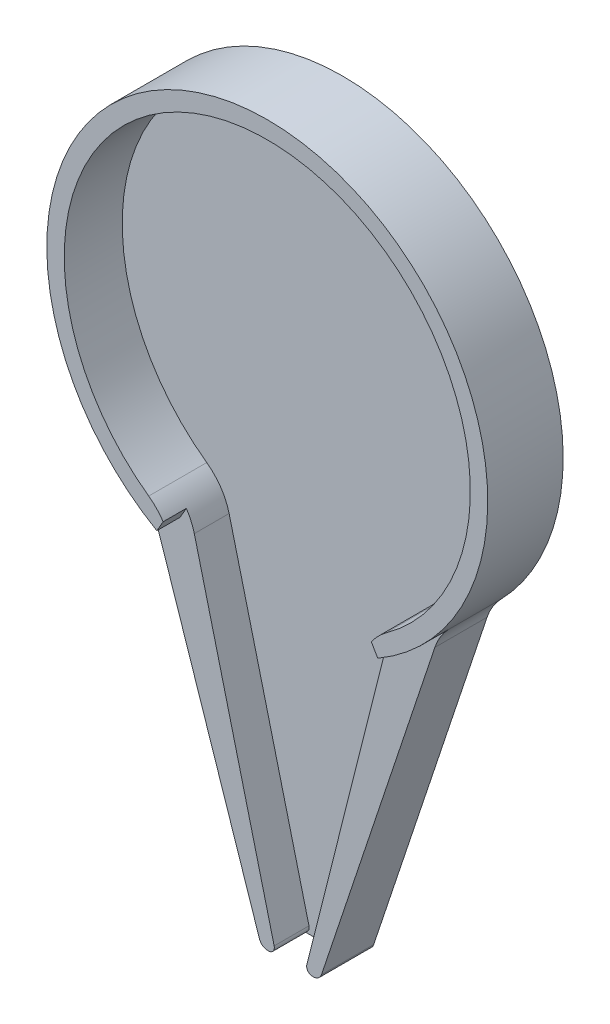
ISO-10303-21;
HEADER;
FILE_DESCRIPTION(('STEP AP214'),'2;1');
FILE_NAME('part.step','',(''),(''),'','','');
FILE_SCHEMA(('AUTOMOTIVE_DESIGN { 1 0 10303 214 1 1 1 1 }'));
ENDSEC;
DATA;
#1=APPLICATION_CONTEXT('core data for automotive mechanical design processes');
#2=APPLICATION_PROTOCOL_DEFINITION('international standard','automotive_design',2000,#1);
#3=PRODUCT_CONTEXT('',#1,'mechanical');
#4=PRODUCT('Part','Part','',(#3));
#5=PRODUCT_RELATED_PRODUCT_CATEGORY('part','',(#4));
#6=PRODUCT_DEFINITION_FORMATION('','',#4);
#7=PRODUCT_DEFINITION_CONTEXT('part definition',#1,'design');
#8=PRODUCT_DEFINITION('design','',#6,#7);
#9=PRODUCT_DEFINITION_SHAPE('','',#8);
#10=(LENGTH_UNIT() NAMED_UNIT(*) SI_UNIT(.MILLI.,.METRE.));
#11=(NAMED_UNIT(*) PLANE_ANGLE_UNIT() SI_UNIT($,.RADIAN.));
#12=(NAMED_UNIT(*) SI_UNIT($,.STERADIAN.) SOLID_ANGLE_UNIT());
#13=UNCERTAINTY_MEASURE_WITH_UNIT(LENGTH_MEASURE(1.E-05),#10,'distance_accuracy_value','');
#14=(GEOMETRIC_REPRESENTATION_CONTEXT(3) GLOBAL_UNCERTAINTY_ASSIGNED_CONTEXT((#13)) GLOBAL_UNIT_ASSIGNED_CONTEXT((#10,
#11,#12)) REPRESENTATION_CONTEXT('',''));
#15=CARTESIAN_POINT('',(0.,0.,0.));
#16=DIRECTION('',(0.,0.,1.));
#17=DIRECTION('',(1.,0.,0.));
#18=AXIS2_PLACEMENT_3D('',#15,#16,#17);
#19=CARTESIAN_POINT('',(0.,0.,10.));
#20=DIRECTION('',(0.,0.,-1.));
#21=DIRECTION('',(-1.,0.,0.));
#22=AXIS2_PLACEMENT_3D('',#19,#20,#21);
#23=CYLINDRICAL_SURFACE('',#22,38.);
#24=CARTESIAN_POINT('',(0.,0.,6.));
#25=DIRECTION('',(0.,0.,1.));
#26=DIRECTION('',(1.,0.,0.));
#27=AXIS2_PLACEMENT_3D('',#24,#25,#26);
#28=CIRCLE('',#27,38.);
#29=CARTESIAN_POINT('',(19.0375883050422,-32.8872350848733,6.));
#30=VERTEX_POINT('',#29);
#31=CARTESIAN_POINT('',(27.2119952938566,-26.5237122614299,6.));
#32=VERTEX_POINT('',#31);
#33=EDGE_CURVE('E321',#30,#32,#28,.T.);
#34=ORIENTED_EDGE('',*,*,#33,.T.);
#35=DIRECTION('',(0.,0.,-1.));
#36=VECTOR('',#35,1.);
#37=CARTESIAN_POINT('',(27.2119952938566,-26.5237122614299,10.));
#38=LINE('',#37,#36);
#39=CARTESIAN_POINT('',(27.2119952938566,-26.5237122614299,-3.));
#40=VERTEX_POINT('',#39);
#41=EDGE_CURVE('E258',#32,#40,#38,.T.);
#42=ORIENTED_EDGE('',*,*,#41,.T.);
#43=CARTESIAN_POINT('',(0.,0.,-3.));
#44=DIRECTION('',(0.,0.,-1.));
#45=DIRECTION('',(-1.,0.,0.));
#46=AXIS2_PLACEMENT_3D('',#43,#44,#45);
#47=CIRCLE('',#46,38.);
#48=CARTESIAN_POINT('',(-27.2119952938566,-26.5237122614299,-3.));
#49=VERTEX_POINT('',#48);
#50=EDGE_CURVE('E219',#49,#40,#47,.T.);
#51=ORIENTED_EDGE('',*,*,#50,.F.);
#52=DIRECTION('',(0.,0.,-1.));
#53=VECTOR('',#52,1.);
#54=CARTESIAN_POINT('',(-27.2119952938566,-26.5237122614299,10.));
#55=LINE('',#54,#53);
#56=CARTESIAN_POINT('',(-27.2119952938566,-26.5237122614299,6.));
#57=VERTEX_POINT('',#56);
#58=EDGE_CURVE('E197',#49,#57,#55,.F.);
#59=ORIENTED_EDGE('',*,*,#58,.T.);
#60=CARTESIAN_POINT('',(0.,0.,6.));
#61=DIRECTION('',(0.,0.,1.));
#62=DIRECTION('',(1.,0.,0.));
#63=AXIS2_PLACEMENT_3D('',#60,#61,#62);
#64=CIRCLE('',#63,38.);
#65=CARTESIAN_POINT('',(-19.0375883050422,-32.8872350848733,6.));
#66=VERTEX_POINT('',#65);
#67=EDGE_CURVE('E175',#57,#66,#64,.T.);
#68=ORIENTED_EDGE('',*,*,#67,.T.);
#69=DIRECTION('',(0.,0.,-1.));
#70=VECTOR('',#69,1.);
#71=CARTESIAN_POINT('',(-19.0375883050422,-32.8872350848733,10.));
#72=LINE('',#71,#70);
#73=CARTESIAN_POINT('',(-19.0375883050422,-32.8872350848733,10.));
#74=VERTEX_POINT('',#73);
#75=EDGE_CURVE('E185',#74,#66,#72,.T.);
#76=ORIENTED_EDGE('',*,*,#75,.F.);
#77=CARTESIAN_POINT('',(0.,0.,10.));
#78=DIRECTION('',(0.,0.,1.));
#79=DIRECTION('',(1.,0.,0.));
#80=AXIS2_PLACEMENT_3D('',#77,#78,#79);
#81=CIRCLE('',#80,38.);
#82=CARTESIAN_POINT('',(19.0375883050422,-32.8872350848733,10.));
#83=VERTEX_POINT('',#82);
#84=EDGE_CURVE('E182',#83,#74,#81,.T.);
#85=ORIENTED_EDGE('',*,*,#84,.F.);
#86=DIRECTION('',(0.,0.,-1.));
#87=VECTOR('',#86,1.);
#88=CARTESIAN_POINT('',(19.0375883050422,-32.8872350848733,10.));
#89=LINE('',#88,#87);
#90=EDGE_CURVE('E192',#83,#30,#89,.T.);
#91=ORIENTED_EDGE('',*,*,#90,.T.);
#92=EDGE_LOOP('',(#34,#42,#51,#59,#68,#76,#85,#91));
#93=FACE_BOUND('',#92,.T.);
#94=ADVANCED_FACE('F33',(#93),#23,.T.);
#95=CARTESIAN_POINT('',(0.,0.,0.));
#96=DIRECTION('',(0.,0.,-1.));
#97=DIRECTION('',(-1.,0.,0.));
#98=AXIS2_PLACEMENT_3D('',#95,#96,#97);
#99=PLANE('',#98);
#100=DIRECTION('',(-0.24417602211815,-0.969730926712434,0.));
#101=VECTOR('',#100,1.);
#102=CARTESIAN_POINT('',(17.5346208072758,-30.290874420278,0.));
#103=LINE('',#102,#101);
#104=CARTESIAN_POINT('',(16.5778493296892,-34.090636917691,0.));
#105=VERTEX_POINT('',#104);
#106=CARTESIAN_POINT('',(2.81328066737598,-88.7558239778818,0.));
#107=VERTEX_POINT('',#106);
#108=EDGE_CURVE('E347',#105,#107,#103,.T.);
#109=ORIENTED_EDGE('',*,*,#108,.F.);
#110=CARTESIAN_POINT('',(26.2751585968136,-36.5323971388724,0.));
#111=DIRECTION('',(0.,0.,-1.));
#112=DIRECTION('',(-1.,0.,0.));
#113=AXIS2_PLACEMENT_3D('',#110,#111,#112);
#114=CIRCLE('',#113,10.);
#115=CARTESIAN_POINT('',(20.4362344641883,-28.4140866635675,0.));
#116=VERTEX_POINT('',#115);
#117=EDGE_CURVE('E262',#105,#116,#114,.T.);
#118=ORIENTED_EDGE('',*,*,#117,.T.);
#119=CARTESIAN_POINT('',(0.,0.,0.));
#120=DIRECTION('',(0.,0.,1.));
#121=DIRECTION('',(1.,0.,0.));
#122=AXIS2_PLACEMENT_3D('',#119,#120,#121);
#123=CIRCLE('',#122,35.);
#124=CARTESIAN_POINT('',(-20.4362344641883,-28.4140866635675,0.));
#125=VERTEX_POINT('',#124);
#126=EDGE_CURVE('E223',#116,#125,#123,.T.);
#127=ORIENTED_EDGE('',*,*,#126,.T.);
#128=CARTESIAN_POINT('',(-26.2751585968136,-36.5323971388724,0.));
#129=DIRECTION('',(0.,0.,-1.));
#130=DIRECTION('',(-1.,0.,0.));
#131=AXIS2_PLACEMENT_3D('',#128,#129,#130);
#132=CIRCLE('',#131,10.);
#133=CARTESIAN_POINT('',(-16.5778493296892,-34.090636917691,0.));
#134=VERTEX_POINT('',#133);
#135=EDGE_CURVE('E264',#125,#134,#132,.T.);
#136=ORIENTED_EDGE('',*,*,#135,.T.);
#137=DIRECTION('',(-0.24417602211815,0.969730926712434,0.));
#138=VECTOR('',#137,1.);
#139=CARTESIAN_POINT('',(-17.5346208072758,-30.290874420278,0.));
#140=LINE('',#139,#138);
#141=CARTESIAN_POINT('',(-2.81328066737598,-88.7558239778818,0.));
#142=VERTEX_POINT('',#141);
#143=EDGE_CURVE('E206',#142,#134,#140,.T.);
#144=ORIENTED_EDGE('',*,*,#143,.F.);
#145=CARTESIAN_POINT('',(-3.78301159408841,-89.,0.));
#146=DIRECTION('',(0.,0.,-1.));
#147=DIRECTION('',(-1.,0.,0.));
#148=AXIS2_PLACEMENT_3D('',#145,#146,#147);
#149=CIRCLE('',#148,1.);
#150=CARTESIAN_POINT('',(-3.78301159408841,-90.,0.));
#151=VERTEX_POINT('',#150);
#152=EDGE_CURVE('E294',#142,#151,#149,.T.);
#153=ORIENTED_EDGE('',*,*,#152,.T.);
#154=DIRECTION('',(1.,0.,0.));
#155=VECTOR('',#154,1.);
#156=CARTESIAN_POINT('',(-5.,-90.,0.));
#157=LINE('',#156,#155);
#158=CARTESIAN_POINT('',(3.78301159408841,-90.,0.));
#159=VERTEX_POINT('',#158);
#160=EDGE_CURVE('E211',#151,#159,#157,.T.);
#161=ORIENTED_EDGE('',*,*,#160,.T.);
#162=CARTESIAN_POINT('',(3.78301159408841,-89.,0.));
#163=DIRECTION('',(0.,0.,-1.));
#164=DIRECTION('',(-1.,0.,0.));
#165=AXIS2_PLACEMENT_3D('',#162,#163,#164);
#166=CIRCLE('',#165,1.);
#167=EDGE_CURVE('E292',#159,#107,#166,.T.);
#168=ORIENTED_EDGE('',*,*,#167,.T.);
#169=EDGE_LOOP('',(#109,#118,#127,#136,#144,#153,#161,#168));
#170=FACE_BOUND('',#169,.T.);
#171=ADVANCED_FACE('F384',(#170),#99,.F.);
#172=CARTESIAN_POINT('',(0.,0.,10.));
#173=DIRECTION('',(0.,0.,1.));
#174=DIRECTION('',(1.,0.,0.));
#175=AXIS2_PLACEMENT_3D('',#172,#173,#174);
#176=PLANE('',#175);
#177=CARTESIAN_POINT('',(0.,0.,10.));
#178=DIRECTION('',(0.,0.,1.));
#179=DIRECTION('',(1.,0.,0.));
#180=AXIS2_PLACEMENT_3D('',#177,#178,#179);
#181=CIRCLE('',#180,35.);
#182=CARTESIAN_POINT('',(20.4362344641883,-28.4140866635675,10.));
#183=VERTEX_POINT('',#182);
#184=CARTESIAN_POINT('',(-20.4362344641883,-28.4140866635675,10.));
#185=VERTEX_POINT('',#184);
#186=EDGE_CURVE('E224',#183,#185,#181,.T.);
#187=ORIENTED_EDGE('',*,*,#186,.F.);
#188=CARTESIAN_POINT('',(26.2751585968136,-36.5323971388724,10.));
#189=DIRECTION('',(0.,0.,1.));
#190=DIRECTION('',(1.,0.,0.));
#191=AXIS2_PLACEMENT_3D('',#188,#189,#190);
#192=CIRCLE('',#191,10.);
#193=CARTESIAN_POINT('',(17.9450327383881,-30.9998567474436,10.));
#194=VERTEX_POINT('',#193);
#195=EDGE_CURVE('E242',#183,#194,#192,.T.);
#196=ORIENTED_EDGE('',*,*,#195,.T.);
#197=DIRECTION('',(-0.500989165922165,0.865453554865085,0.));
#198=VECTOR('',#197,1.);
#199=CARTESIAN_POINT('',(19.0375883050422,-32.8872350848733,10.));
#200=LINE('',#199,#198);
#201=EDGE_CURVE('E198',#83,#194,#200,.T.);
#202=ORIENTED_EDGE('',*,*,#201,.F.);
#203=ORIENTED_EDGE('',*,*,#84,.T.);
#204=DIRECTION('',(-0.500989165922165,-0.865453554865085,0.));
#205=VECTOR('',#204,1.);
#206=CARTESIAN_POINT('',(-19.0375883050422,-32.8872350848733,10.));
#207=LINE('',#206,#205);
#208=CARTESIAN_POINT('',(-17.9450327383881,-30.9998567474436,10.));
#209=VERTEX_POINT('',#208);
#210=EDGE_CURVE('E188',#209,#74,#207,.T.);
#211=ORIENTED_EDGE('',*,*,#210,.F.);
#212=CARTESIAN_POINT('',(-26.2751585968136,-36.5323971388724,10.));
#213=DIRECTION('',(0.,0.,1.));
#214=DIRECTION('',(1.,0.,0.));
#215=AXIS2_PLACEMENT_3D('',#212,#213,#214);
#216=CIRCLE('',#215,10.);
#217=EDGE_CURVE('E240',#209,#185,#216,.T.);
#218=ORIENTED_EDGE('',*,*,#217,.T.);
#219=EDGE_LOOP('',(#187,#196,#202,#203,#211,#218));
#220=FACE_BOUND('',#219,.T.);
#221=ADVANCED_FACE('F368',(#220),#176,.T.);
#222=CARTESIAN_POINT('',(0.,0.,10.));
#223=DIRECTION('',(0.,0.,-1.));
#224=DIRECTION('',(-1.,0.,0.));
#225=AXIS2_PLACEMENT_3D('',#222,#223,#224);
#226=CYLINDRICAL_SURFACE('',#225,35.);
#227=ORIENTED_EDGE('',*,*,#126,.F.);
#228=DIRECTION('',(0.,0.,-1.));
#229=VECTOR('',#228,1.);
#230=CARTESIAN_POINT('',(20.4362344641883,-28.4140866635675,10.));
#231=LINE('',#230,#229);
#232=EDGE_CURVE('E238',#116,#183,#231,.F.);
#233=ORIENTED_EDGE('',*,*,#232,.T.);
#234=ORIENTED_EDGE('',*,*,#186,.T.);
#235=DIRECTION('',(0.,0.,-1.));
#236=VECTOR('',#235,1.);
#237=CARTESIAN_POINT('',(-20.4362344641883,-28.4140866635675,10.));
#238=LINE('',#237,#236);
#239=EDGE_CURVE('E235',#185,#125,#238,.T.);
#240=ORIENTED_EDGE('',*,*,#239,.T.);
#241=EDGE_LOOP('',(#227,#233,#234,#240));
#242=FACE_BOUND('',#241,.T.);
#243=ADVANCED_FACE('F422',(#242),#226,.F.);
#244=CARTESIAN_POINT('',(0.,0.,-3.));
#245=DIRECTION('',(0.,0.,-1.));
#246=DIRECTION('',(-1.,0.,0.));
#247=AXIS2_PLACEMENT_3D('',#244,#245,#246);
#248=PLANE('',#247);
#249=DIRECTION('',(0.316227766016838,0.948683298050514,0.));
#250=VECTOR('',#249,1.);
#251=CARTESIAN_POINT('',(5.,-90.,-3.));
#252=LINE('',#251,#250);
#253=CARTESIAN_POINT('',(5.34188611699158,-88.9743416490252,-3.));
#254=VERTEX_POINT('',#253);
#255=CARTESIAN_POINT('',(24.8862137064716,-30.3413588805852,-3.));
#256=VERTEX_POINT('',#255);
#257=EDGE_CURVE('E217',#254,#256,#252,.T.);
#258=ORIENTED_EDGE('',*,*,#257,.F.);
#259=CARTESIAN_POINT('',(3.91886116991581,-88.5,-3.));
#260=DIRECTION('',(0.,0.,-1.));
#261=DIRECTION('',(-1.,0.,0.));
#262=AXIS2_PLACEMENT_3D('',#259,#260,#261);
#263=CIRCLE('',#262,1.5);
#264=CARTESIAN_POINT('',(3.91886116991581,-90.,-3.));
#265=VERTEX_POINT('',#264);
#266=EDGE_CURVE('E307',#254,#265,#263,.T.);
#267=ORIENTED_EDGE('',*,*,#266,.T.);
#268=DIRECTION('',(1.,0.,0.));
#269=VECTOR('',#268,1.);
#270=CARTESIAN_POINT('',(-5.,-90.,-3.));
#271=LINE('',#270,#269);
#272=CARTESIAN_POINT('',(-3.91886116991581,-90.,-3.));
#273=VERTEX_POINT('',#272);
#274=EDGE_CURVE('E214',#273,#265,#271,.T.);
#275=ORIENTED_EDGE('',*,*,#274,.F.);
#276=CARTESIAN_POINT('',(-3.91886116991581,-88.5,-3.));
#277=DIRECTION('',(0.,0.,-1.));
#278=DIRECTION('',(-1.,0.,0.));
#279=AXIS2_PLACEMENT_3D('',#276,#277,#278);
#280=CIRCLE('',#279,1.5);
#281=CARTESIAN_POINT('',(-5.34188611699158,-88.9743416490252,-3.));
#282=VERTEX_POINT('',#281);
#283=EDGE_CURVE('E54',#273,#282,#280,.T.);
#284=ORIENTED_EDGE('',*,*,#283,.T.);
#285=DIRECTION('',(0.316227766016838,-0.948683298050514,0.));
#286=VECTOR('',#285,1.);
#287=CARTESIAN_POINT('',(-5.,-90.,-3.));
#288=LINE('',#287,#286);
#289=CARTESIAN_POINT('',(-24.8862137064716,-30.3413588805852,-3.));
#290=VERTEX_POINT('',#289);
#291=EDGE_CURVE('E212',#290,#282,#288,.T.);
#292=ORIENTED_EDGE('',*,*,#291,.F.);
#293=CARTESIAN_POINT('',(-34.3730466869767,-33.5036365407536,-3.));
#294=DIRECTION('',(0.,0.,-1.));
#295=DIRECTION('',(-1.,0.,0.));
#296=AXIS2_PLACEMENT_3D('',#293,#294,#295);
#297=CIRCLE('',#296,10.);
#298=EDGE_CURVE('E275',#290,#49,#297,.F.);
#299=ORIENTED_EDGE('',*,*,#298,.T.);
#300=ORIENTED_EDGE('',*,*,#50,.T.);
#301=CARTESIAN_POINT('',(34.3730466869767,-33.5036365407536,-3.));
#302=DIRECTION('',(0.,0.,-1.));
#303=DIRECTION('',(-1.,0.,0.));
#304=AXIS2_PLACEMENT_3D('',#301,#302,#303);
#305=CIRCLE('',#304,10.);
#306=EDGE_CURVE('E270',#40,#256,#305,.F.);
#307=ORIENTED_EDGE('',*,*,#306,.T.);
#308=EDGE_LOOP('',(#258,#267,#275,#284,#292,#299,#300,#307));
#309=FACE_BOUND('',#308,.T.);
#310=ADVANCED_FACE('F317',(#309),#248,.T.);
#311=CARTESIAN_POINT('',(-5.,-90.,-3.));
#312=DIRECTION('',(-0.948683298050514,-0.316227766016838,0.));
#313=DIRECTION('',(0.316227766016838,-0.948683298050514,0.));
#314=AXIS2_PLACEMENT_3D('',#311,#312,#313);
#315=PLANE('',#314);
#316=ORIENTED_EDGE('',*,*,#291,.T.);
#317=DIRECTION('',(0.,0.,1.));
#318=VECTOR('',#317,1.);
#319=CARTESIAN_POINT('',(-5.34188611699158,-88.9743416490252,-3.));
#320=LINE('',#319,#318);
#321=CARTESIAN_POINT('',(-5.34188611699158,-88.9743416490252,6.));
#322=VERTEX_POINT('',#321);
#323=EDGE_CURVE('E41',#282,#322,#320,.T.);
#324=ORIENTED_EDGE('',*,*,#323,.T.);
#325=DIRECTION('',(0.316227766016838,-0.948683298050514,0.));
#326=VECTOR('',#325,1.);
#327=CARTESIAN_POINT('',(-5.,-90.,6.));
#328=LINE('',#327,#326);
#329=CARTESIAN_POINT('',(-24.8862137064716,-30.3413588805852,6.));
#330=VERTEX_POINT('',#329);
#331=EDGE_CURVE('E199',#330,#322,#328,.T.);
#332=ORIENTED_EDGE('',*,*,#331,.F.);
#333=DIRECTION('',(0.,0.,-1.));
#334=VECTOR('',#333,1.);
#335=CARTESIAN_POINT('',(-24.8862137064716,-30.3413588805852,-3.));
#336=LINE('',#335,#334);
#337=EDGE_CURVE('E260',#330,#290,#336,.T.);
#338=ORIENTED_EDGE('',*,*,#337,.T.);
#339=EDGE_LOOP('',(#316,#324,#332,#338));
#340=FACE_BOUND('',#339,.T.);
#341=ADVANCED_FACE('F310',(#340),#315,.T.);
#342=CARTESIAN_POINT('',(5.,-90.,-3.));
#343=DIRECTION('',(0.948683298050514,-0.316227766016838,0.));
#344=DIRECTION('',(0.316227766016838,0.948683298050514,0.));
#345=AXIS2_PLACEMENT_3D('',#342,#343,#344);
#346=PLANE('',#345);
#347=DIRECTION('',(0.316227766016838,0.948683298050514,0.));
#348=VECTOR('',#347,1.);
#349=CARTESIAN_POINT('',(5.,-90.,6.));
#350=LINE('',#349,#348);
#351=CARTESIAN_POINT('',(5.34188611699158,-88.9743416490252,6.));
#352=VERTEX_POINT('',#351);
#353=CARTESIAN_POINT('',(24.8862137064716,-30.3413588805852,6.));
#354=VERTEX_POINT('',#353);
#355=EDGE_CURVE('E343',#352,#354,#350,.T.);
#356=ORIENTED_EDGE('',*,*,#355,.F.);
#357=DIRECTION('',(0.,0.,1.));
#358=VECTOR('',#357,1.);
#359=CARTESIAN_POINT('',(5.34188611699158,-88.9743416490252,-3.));
#360=LINE('',#359,#358);
#361=EDGE_CURVE('E304',#352,#254,#360,.F.);
#362=ORIENTED_EDGE('',*,*,#361,.T.);
#363=ORIENTED_EDGE('',*,*,#257,.T.);
#364=DIRECTION('',(0.,0.,-1.));
#365=VECTOR('',#364,1.);
#366=CARTESIAN_POINT('',(24.8862137064716,-30.3413588805852,-3.));
#367=LINE('',#366,#365);
#368=EDGE_CURVE('E254',#256,#354,#367,.F.);
#369=ORIENTED_EDGE('',*,*,#368,.T.);
#370=EDGE_LOOP('',(#356,#362,#363,#369));
#371=FACE_BOUND('',#370,.T.);
#372=ADVANCED_FACE('F372',(#371),#346,.T.);
#373=CARTESIAN_POINT('',(-5.,-90.,-3.));
#374=DIRECTION('',(0.,-1.,0.));
#375=DIRECTION('',(0.,0.,-1.));
#376=AXIS2_PLACEMENT_3D('',#373,#374,#375);
#377=PLANE('',#376);
#378=ORIENTED_EDGE('',*,*,#274,.T.);
#379=DIRECTION('',(0.,0.,1.));
#380=VECTOR('',#379,1.);
#381=CARTESIAN_POINT('',(3.91886116991581,-90.,-3.));
#382=LINE('',#381,#380);
#383=CARTESIAN_POINT('',(3.91886116991581,-90.,6.));
#384=VERTEX_POINT('',#383);
#385=EDGE_CURVE('E299',#265,#384,#382,.T.);
#386=ORIENTED_EDGE('',*,*,#385,.T.);
#387=DIRECTION('',(1.,0.,0.));
#388=VECTOR('',#387,1.);
#389=CARTESIAN_POINT('',(2.5,-90.,6.));
#390=LINE('',#389,#388);
#391=CARTESIAN_POINT('',(3.78301159408841,-90.,6.));
#392=VERTEX_POINT('',#391);
#393=EDGE_CURVE('E336',#392,#384,#390,.T.);
#394=ORIENTED_EDGE('',*,*,#393,.F.);
#395=DIRECTION('',(0.,0.,-1.));
#396=VECTOR('',#395,1.);
#397=CARTESIAN_POINT('',(3.78301159408841,-90.,0.));
#398=LINE('',#397,#396);
#399=EDGE_CURVE('E280',#392,#159,#398,.T.);
#400=ORIENTED_EDGE('',*,*,#399,.T.);
#401=ORIENTED_EDGE('',*,*,#160,.F.);
#402=DIRECTION('',(0.,0.,-1.));
#403=VECTOR('',#402,1.);
#404=CARTESIAN_POINT('',(-3.78301159408841,-90.,6.));
#405=LINE('',#404,#403);
#406=CARTESIAN_POINT('',(-3.78301159408841,-90.,6.));
#407=VERTEX_POINT('',#406);
#408=EDGE_CURVE('E277',#151,#407,#405,.F.);
#409=ORIENTED_EDGE('',*,*,#408,.T.);
#410=DIRECTION('',(1.,0.,0.));
#411=VECTOR('',#410,1.);
#412=CARTESIAN_POINT('',(-2.5,-90.,6.));
#413=LINE('',#412,#411);
#414=CARTESIAN_POINT('',(-3.91886116991581,-90.,6.));
#415=VERTEX_POINT('',#414);
#416=EDGE_CURVE('E353',#415,#407,#413,.T.);
#417=ORIENTED_EDGE('',*,*,#416,.F.);
#418=DIRECTION('',(0.,0.,1.));
#419=VECTOR('',#418,1.);
#420=CARTESIAN_POINT('',(-3.91886116991581,-90.,-3.));
#421=LINE('',#420,#419);
#422=EDGE_CURVE('E297',#415,#273,#421,.F.);
#423=ORIENTED_EDGE('',*,*,#422,.T.);
#424=EDGE_LOOP('',(#378,#386,#394,#400,#401,#409,#417,#423));
#425=FACE_BOUND('',#424,.T.);
#426=ADVANCED_FACE('F335',(#425),#377,.T.);
#427=CARTESIAN_POINT('',(19.0375883050422,-32.8872350848733,10.));
#428=DIRECTION('',(-0.865453554865086,-0.500989165922165,0.));
#429=DIRECTION('',(0.500989165922165,-0.865453554865086,0.));
#430=AXIS2_PLACEMENT_3D('',#427,#428,#429);
#431=PLANE('',#430);
#432=ORIENTED_EDGE('',*,*,#201,.T.);
#433=DIRECTION('',(0.,0.,-1.));
#434=VECTOR('',#433,1.);
#435=CARTESIAN_POINT('',(17.9450327383881,-30.9998567474436,10.));
#436=LINE('',#435,#434);
#437=CARTESIAN_POINT('',(17.9450327383881,-30.9998567474436,6.));
#438=VERTEX_POINT('',#437);
#439=EDGE_CURVE('E244',#194,#438,#436,.T.);
#440=ORIENTED_EDGE('',*,*,#439,.T.);
#441=DIRECTION('',(-0.500989165922165,0.865453554865086,0.));
#442=VECTOR('',#441,1.);
#443=CARTESIAN_POINT('',(19.0375883050422,-32.8872350848733,6.));
#444=LINE('',#443,#442);
#445=EDGE_CURVE('E181',#30,#438,#444,.T.);
#446=ORIENTED_EDGE('',*,*,#445,.F.);
#447=ORIENTED_EDGE('',*,*,#90,.F.);
#448=EDGE_LOOP('',(#432,#440,#446,#447));
#449=FACE_BOUND('',#448,.T.);
#450=ADVANCED_FACE('F379',(#449),#431,.T.);
#451=CARTESIAN_POINT('',(-19.0375883050422,-32.8872350848733,10.));
#452=DIRECTION('',(0.865453554865086,-0.500989165922165,0.));
#453=DIRECTION('',(0.500989165922165,0.865453554865086,0.));
#454=AXIS2_PLACEMENT_3D('',#451,#452,#453);
#455=PLANE('',#454);
#456=DIRECTION('',(-0.500989165922165,-0.865453554865086,0.));
#457=VECTOR('',#456,1.);
#458=CARTESIAN_POINT('',(-19.0375883050422,-32.8872350848733,6.));
#459=LINE('',#458,#457);
#460=CARTESIAN_POINT('',(-17.9450327383881,-30.9998567474436,6.));
#461=VERTEX_POINT('',#460);
#462=EDGE_CURVE('E170',#461,#66,#459,.T.);
#463=ORIENTED_EDGE('',*,*,#462,.F.);
#464=DIRECTION('',(0.,0.,-1.));
#465=VECTOR('',#464,1.);
#466=CARTESIAN_POINT('',(-17.9450327383881,-30.9998567474436,6.));
#467=LINE('',#466,#465);
#468=EDGE_CURVE('E252',#461,#209,#467,.F.);
#469=ORIENTED_EDGE('',*,*,#468,.T.);
#470=ORIENTED_EDGE('',*,*,#210,.T.);
#471=ORIENTED_EDGE('',*,*,#75,.T.);
#472=EDGE_LOOP('',(#463,#469,#470,#471));
#473=FACE_BOUND('',#472,.T.);
#474=ADVANCED_FACE('F186',(#473),#455,.T.);
#475=CARTESIAN_POINT('',(0.,0.,6.));
#476=DIRECTION('',(0.,0.,1.));
#477=DIRECTION('',(1.,0.,0.));
#478=AXIS2_PLACEMENT_3D('',#475,#476,#477);
#479=PLANE('',#478);
#480=ORIENTED_EDGE('',*,*,#331,.T.);
#481=CARTESIAN_POINT('',(-3.91886116991581,-88.5,6.));
#482=DIRECTION('',(0.,0.,1.));
#483=DIRECTION('',(1.,0.,0.));
#484=AXIS2_PLACEMENT_3D('',#481,#482,#483);
#485=CIRCLE('',#484,1.5);
#486=EDGE_CURVE('E11',#322,#415,#485,.T.);
#487=ORIENTED_EDGE('',*,*,#486,.T.);
#488=ORIENTED_EDGE('',*,*,#416,.T.);
#489=CARTESIAN_POINT('',(-3.78301159408841,-89.,6.));
#490=DIRECTION('',(0.,0.,1.));
#491=DIRECTION('',(1.,0.,0.));
#492=AXIS2_PLACEMENT_3D('',#489,#490,#491);
#493=CIRCLE('',#492,1.);
#494=CARTESIAN_POINT('',(-2.81328066737598,-88.7558239778818,6.));
#495=VERTEX_POINT('',#494);
#496=EDGE_CURVE('E290',#407,#495,#493,.T.);
#497=ORIENTED_EDGE('',*,*,#496,.T.);
#498=DIRECTION('',(-0.24417602211815,0.969730926712434,0.));
#499=VECTOR('',#498,1.);
#500=CARTESIAN_POINT('',(-17.5346208072758,-30.290874420278,6.));
#501=LINE('',#500,#499);
#502=CARTESIAN_POINT('',(-16.5778493296892,-34.090636917691,6.));
#503=VERTEX_POINT('',#502);
#504=EDGE_CURVE('E203',#495,#503,#501,.T.);
#505=ORIENTED_EDGE('',*,*,#504,.T.);
#506=CARTESIAN_POINT('',(-26.2751585968136,-36.5323971388724,6.));
#507=DIRECTION('',(0.,0.,1.));
#508=DIRECTION('',(1.,0.,0.));
#509=AXIS2_PLACEMENT_3D('',#506,#507,#508);
#510=CIRCLE('',#509,10.);
#511=EDGE_CURVE('E178',#503,#461,#510,.T.);
#512=ORIENTED_EDGE('',*,*,#511,.T.);
#513=ORIENTED_EDGE('',*,*,#462,.T.);
#514=ORIENTED_EDGE('',*,*,#67,.F.);
#515=CARTESIAN_POINT('',(-34.3730466869767,-33.5036365407536,6.));
#516=DIRECTION('',(0.,0.,1.));
#517=DIRECTION('',(1.,0.,0.));
#518=AXIS2_PLACEMENT_3D('',#515,#516,#517);
#519=CIRCLE('',#518,10.);
#520=EDGE_CURVE('E273',#57,#330,#519,.F.);
#521=ORIENTED_EDGE('',*,*,#520,.T.);
#522=EDGE_LOOP('',(#480,#487,#488,#497,#505,#512,#513,#514,#521));
#523=FACE_BOUND('',#522,.T.);
#524=ADVANCED_FACE('F173',(#523),#479,.T.);
#525=CARTESIAN_POINT('',(-17.5346208072758,-30.290874420278,6.));
#526=DIRECTION('',(-0.969730926712434,-0.24417602211815,0.));
#527=DIRECTION('',(0.24417602211815,-0.969730926712434,0.));
#528=AXIS2_PLACEMENT_3D('',#525,#526,#527);
#529=PLANE('',#528);
#530=ORIENTED_EDGE('',*,*,#504,.F.);
#531=DIRECTION('',(0.,0.,-1.));
#532=VECTOR('',#531,1.);
#533=CARTESIAN_POINT('',(-2.81328066737598,-88.7558239778818,0.));
#534=LINE('',#533,#532);
#535=EDGE_CURVE('E287',#495,#142,#534,.T.);
#536=ORIENTED_EDGE('',*,*,#535,.T.);
#537=ORIENTED_EDGE('',*,*,#143,.T.);
#538=DIRECTION('',(0.,0.,1.));
#539=VECTOR('',#538,1.);
#540=CARTESIAN_POINT('',(-16.5778493296892,-34.090636917691,6.));
#541=LINE('',#540,#539);
#542=EDGE_CURVE('E248',#134,#503,#541,.T.);
#543=ORIENTED_EDGE('',*,*,#542,.T.);
#544=EDGE_LOOP('',(#530,#536,#537,#543));
#545=FACE_BOUND('',#544,.T.);
#546=ADVANCED_FACE('F360',(#545),#529,.F.);
#547=CARTESIAN_POINT('',(0.,0.,6.));
#548=DIRECTION('',(0.,0.,1.));
#549=DIRECTION('',(1.,0.,0.));
#550=AXIS2_PLACEMENT_3D('',#547,#548,#549);
#551=PLANE('',#550);
#552=ORIENTED_EDGE('',*,*,#393,.T.);
#553=CARTESIAN_POINT('',(3.91886116991581,-88.5,6.));
#554=DIRECTION('',(0.,0.,1.));
#555=DIRECTION('',(1.,0.,0.));
#556=AXIS2_PLACEMENT_3D('',#553,#554,#555);
#557=CIRCLE('',#556,1.5);
#558=EDGE_CURVE('E302',#384,#352,#557,.T.);
#559=ORIENTED_EDGE('',*,*,#558,.T.);
#560=ORIENTED_EDGE('',*,*,#355,.T.);
#561=CARTESIAN_POINT('',(34.3730466869767,-33.5036365407536,6.));
#562=DIRECTION('',(0.,0.,1.));
#563=DIRECTION('',(1.,0.,0.));
#564=AXIS2_PLACEMENT_3D('',#561,#562,#563);
#565=CIRCLE('',#564,10.);
#566=EDGE_CURVE('E267',#354,#32,#565,.F.);
#567=ORIENTED_EDGE('',*,*,#566,.T.);
#568=ORIENTED_EDGE('',*,*,#33,.F.);
#569=ORIENTED_EDGE('',*,*,#445,.T.);
#570=CARTESIAN_POINT('',(26.2751585968136,-36.5323971388724,6.));
#571=DIRECTION('',(0.,0.,1.));
#572=DIRECTION('',(1.,0.,0.));
#573=AXIS2_PLACEMENT_3D('',#570,#571,#572);
#574=CIRCLE('',#573,10.);
#575=CARTESIAN_POINT('',(16.5778493296892,-34.090636917691,6.));
#576=VERTEX_POINT('',#575);
#577=EDGE_CURVE('E246',#438,#576,#574,.T.);
#578=ORIENTED_EDGE('',*,*,#577,.T.);
#579=DIRECTION('',(-0.24417602211815,-0.969730926712434,0.));
#580=VECTOR('',#579,1.);
#581=CARTESIAN_POINT('',(17.5346208072758,-30.290874420278,6.));
#582=LINE('',#581,#580);
#583=CARTESIAN_POINT('',(2.81328066737598,-88.7558239778818,6.));
#584=VERTEX_POINT('',#583);
#585=EDGE_CURVE('E344',#576,#584,#582,.T.);
#586=ORIENTED_EDGE('',*,*,#585,.T.);
#587=CARTESIAN_POINT('',(3.78301159408841,-89.,6.));
#588=DIRECTION('',(0.,0.,1.));
#589=DIRECTION('',(1.,0.,0.));
#590=AXIS2_PLACEMENT_3D('',#587,#588,#589);
#591=CIRCLE('',#590,1.);
#592=EDGE_CURVE('E285',#584,#392,#591,.T.);
#593=ORIENTED_EDGE('',*,*,#592,.T.);
#594=EDGE_LOOP('',(#552,#559,#560,#567,#568,#569,#578,#586,#593));
#595=FACE_BOUND('',#594,.T.);
#596=ADVANCED_FACE('F339',(#595),#551,.T.);
#597=CARTESIAN_POINT('',(17.5346208072758,-30.290874420278,6.));
#598=DIRECTION('',(0.969730926712434,-0.24417602211815,0.));
#599=DIRECTION('',(0.24417602211815,0.969730926712434,0.));
#600=AXIS2_PLACEMENT_3D('',#597,#598,#599);
#601=PLANE('',#600);
#602=ORIENTED_EDGE('',*,*,#108,.T.);
#603=DIRECTION('',(0.,0.,-1.));
#604=VECTOR('',#603,1.);
#605=CARTESIAN_POINT('',(2.81328066737598,-88.7558239778818,6.));
#606=LINE('',#605,#604);
#607=EDGE_CURVE('E283',#107,#584,#606,.F.);
#608=ORIENTED_EDGE('',*,*,#607,.T.);
#609=ORIENTED_EDGE('',*,*,#585,.F.);
#610=DIRECTION('',(0.,0.,1.));
#611=VECTOR('',#610,1.);
#612=CARTESIAN_POINT('',(16.5778493296892,-34.090636917691,0.));
#613=LINE('',#612,#611);
#614=EDGE_CURVE('E232',#576,#105,#613,.F.);
#615=ORIENTED_EDGE('',*,*,#614,.T.);
#616=EDGE_LOOP('',(#602,#608,#609,#615));
#617=FACE_BOUND('',#616,.T.);
#618=ADVANCED_FACE('F397',(#617),#601,.F.);
#619=CARTESIAN_POINT('',(26.2751585968136,-36.5323971388724,10.));
#620=DIRECTION('',(0.,0.,-1.));
#621=DIRECTION('',(-1.,0.,0.));
#622=AXIS2_PLACEMENT_3D('',#619,#620,#621);
#623=CYLINDRICAL_SURFACE('',#622,10.);
#624=ORIENTED_EDGE('',*,*,#195,.F.);
#625=ORIENTED_EDGE('',*,*,#232,.F.);
#626=ORIENTED_EDGE('',*,*,#117,.F.);
#627=ORIENTED_EDGE('',*,*,#614,.F.);
#628=ORIENTED_EDGE('',*,*,#577,.F.);
#629=ORIENTED_EDGE('',*,*,#439,.F.);
#630=EDGE_LOOP('',(#624,#625,#626,#627,#628,#629));
#631=FACE_BOUND('',#630,.T.);
#632=ADVANCED_FACE('F394',(#631),#623,.T.);
#633=CARTESIAN_POINT('',(-26.2751585968136,-36.5323971388724,10.));
#634=DIRECTION('',(0.,0.,-1.));
#635=DIRECTION('',(-1.,0.,0.));
#636=AXIS2_PLACEMENT_3D('',#633,#634,#635);
#637=CYLINDRICAL_SURFACE('',#636,10.);
#638=ORIENTED_EDGE('',*,*,#511,.F.);
#639=ORIENTED_EDGE('',*,*,#542,.F.);
#640=ORIENTED_EDGE('',*,*,#135,.F.);
#641=ORIENTED_EDGE('',*,*,#239,.F.);
#642=ORIENTED_EDGE('',*,*,#217,.F.);
#643=ORIENTED_EDGE('',*,*,#468,.F.);
#644=EDGE_LOOP('',(#638,#639,#640,#641,#642,#643));
#645=FACE_BOUND('',#644,.T.);
#646=ADVANCED_FACE('F363',(#645),#637,.T.);
#647=CARTESIAN_POINT('',(34.3730466869767,-33.5036365407536,10.));
#648=DIRECTION('',(0.,0.,-1.));
#649=DIRECTION('',(-1.,0.,0.));
#650=AXIS2_PLACEMENT_3D('',#647,#648,#649);
#651=CYLINDRICAL_SURFACE('',#650,10.);
#652=ORIENTED_EDGE('',*,*,#306,.F.);
#653=ORIENTED_EDGE('',*,*,#41,.F.);
#654=ORIENTED_EDGE('',*,*,#566,.F.);
#655=ORIENTED_EDGE('',*,*,#368,.F.);
#656=EDGE_LOOP('',(#652,#653,#654,#655));
#657=FACE_BOUND('',#656,.T.);
#658=ADVANCED_FACE('F324',(#657),#651,.F.);
#659=CARTESIAN_POINT('',(-34.3730466869767,-33.5036365407536,10.));
#660=DIRECTION('',(0.,0.,-1.));
#661=DIRECTION('',(-1.,0.,0.));
#662=AXIS2_PLACEMENT_3D('',#659,#660,#661);
#663=CYLINDRICAL_SURFACE('',#662,10.);
#664=ORIENTED_EDGE('',*,*,#298,.F.);
#665=ORIENTED_EDGE('',*,*,#337,.F.);
#666=ORIENTED_EDGE('',*,*,#520,.F.);
#667=ORIENTED_EDGE('',*,*,#58,.F.);
#668=EDGE_LOOP('',(#664,#665,#666,#667));
#669=FACE_BOUND('',#668,.T.);
#670=ADVANCED_FACE('F315',(#669),#663,.F.);
#671=CARTESIAN_POINT('',(3.78301159408841,-89.,-3.));
#672=DIRECTION('',(0.,0.,1.));
#673=DIRECTION('',(1.,0.,0.));
#674=AXIS2_PLACEMENT_3D('',#671,#672,#673);
#675=CYLINDRICAL_SURFACE('',#674,1.);
#676=ORIENTED_EDGE('',*,*,#592,.F.);
#677=ORIENTED_EDGE('',*,*,#607,.F.);
#678=ORIENTED_EDGE('',*,*,#167,.F.);
#679=ORIENTED_EDGE('',*,*,#399,.F.);
#680=EDGE_LOOP('',(#676,#677,#678,#679));
#681=FACE_BOUND('',#680,.T.);
#682=ADVANCED_FACE('F405',(#681),#675,.T.);
#683=CARTESIAN_POINT('',(-3.78301159408841,-89.,6.));
#684=DIRECTION('',(0.,0.,1.));
#685=DIRECTION('',(1.,0.,0.));
#686=AXIS2_PLACEMENT_3D('',#683,#684,#685);
#687=CYLINDRICAL_SURFACE('',#686,1.);
#688=ORIENTED_EDGE('',*,*,#496,.F.);
#689=ORIENTED_EDGE('',*,*,#408,.F.);
#690=ORIENTED_EDGE('',*,*,#152,.F.);
#691=ORIENTED_EDGE('',*,*,#535,.F.);
#692=EDGE_LOOP('',(#688,#689,#690,#691));
#693=FACE_BOUND('',#692,.T.);
#694=ADVANCED_FACE('F408',(#693),#687,.T.);
#695=CARTESIAN_POINT('',(3.91886116991581,-88.5,-3.));
#696=DIRECTION('',(0.,0.,1.));
#697=DIRECTION('',(1.,0.,0.));
#698=AXIS2_PLACEMENT_3D('',#695,#696,#697);
#699=CYLINDRICAL_SURFACE('',#698,1.5);
#700=ORIENTED_EDGE('',*,*,#266,.F.);
#701=ORIENTED_EDGE('',*,*,#361,.F.);
#702=ORIENTED_EDGE('',*,*,#558,.F.);
#703=ORIENTED_EDGE('',*,*,#385,.F.);
#704=EDGE_LOOP('',(#700,#701,#702,#703));
#705=FACE_BOUND('',#704,.T.);
#706=ADVANCED_FACE('F331',(#705),#699,.T.);
#707=CARTESIAN_POINT('',(-3.91886116991581,-88.5,-3.));
#708=DIRECTION('',(0.,0.,1.));
#709=DIRECTION('',(1.,0.,0.));
#710=AXIS2_PLACEMENT_3D('',#707,#708,#709);
#711=CYLINDRICAL_SURFACE('',#710,1.5);
#712=ORIENTED_EDGE('',*,*,#283,.F.);
#713=ORIENTED_EDGE('',*,*,#422,.F.);
#714=ORIENTED_EDGE('',*,*,#486,.F.);
#715=ORIENTED_EDGE('',*,*,#323,.F.);
#716=EDGE_LOOP('',(#712,#713,#714,#715));
#717=FACE_BOUND('',#716,.T.);
#718=ADVANCED_FACE('F35',(#717),#711,.T.);
#719=CLOSED_SHELL('',(#94,#171,#221,#243,#310,#341,#372,#426,#450,#474,#524,#546,#596,#618,#632,
#646,#658,#670,#682,#694,#706,#718));
#720=MANIFOLD_SOLID_BREP('B2',#719);
#721=ADVANCED_BREP_SHAPE_REPRESENTATION('',(#18,#720),#14);
#722=SHAPE_DEFINITION_REPRESENTATION(#9,#721);
ENDSEC;
END-ISO-10303-21;
